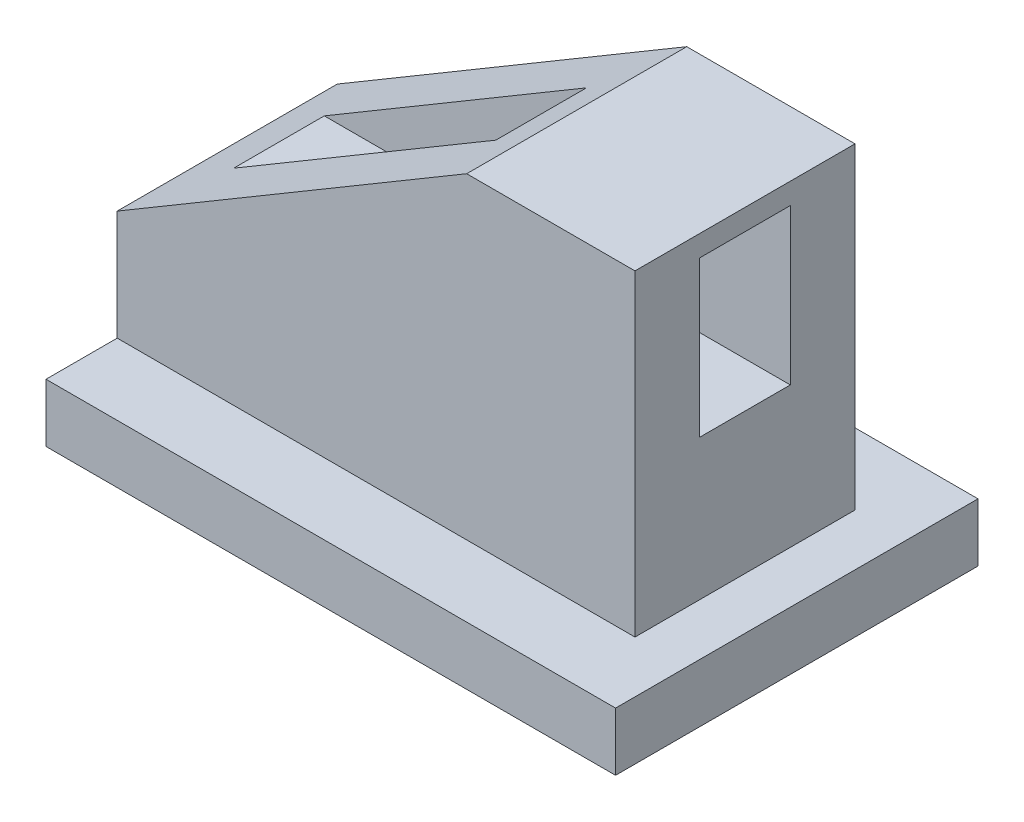
ISO-10303-21;
HEADER;
FILE_DESCRIPTION(('STEP AP214'),'2;1');
FILE_NAME('part.step','',(''),(''),'','','');
FILE_SCHEMA(('AUTOMOTIVE_DESIGN { 1 0 10303 214 1 1 1 1 }'));
ENDSEC;
DATA;
#1=APPLICATION_CONTEXT('core data for automotive mechanical design processes');
#2=APPLICATION_PROTOCOL_DEFINITION('international standard','automotive_design',2000,#1);
#3=PRODUCT_CONTEXT('',#1,'mechanical');
#4=PRODUCT('Part','Part','',(#3));
#5=PRODUCT_RELATED_PRODUCT_CATEGORY('part','',(#4));
#6=PRODUCT_DEFINITION_FORMATION('','',#4);
#7=PRODUCT_DEFINITION_CONTEXT('part definition',#1,'design');
#8=PRODUCT_DEFINITION('design','',#6,#7);
#9=PRODUCT_DEFINITION_SHAPE('','',#8);
#10=(LENGTH_UNIT() NAMED_UNIT(*) SI_UNIT(.MILLI.,.METRE.));
#11=(NAMED_UNIT(*) PLANE_ANGLE_UNIT() SI_UNIT($,.RADIAN.));
#12=(NAMED_UNIT(*) SI_UNIT($,.STERADIAN.) SOLID_ANGLE_UNIT());
#13=UNCERTAINTY_MEASURE_WITH_UNIT(LENGTH_MEASURE(1.E-05),#10,'distance_accuracy_value','');
#14=(GEOMETRIC_REPRESENTATION_CONTEXT(3) GLOBAL_UNCERTAINTY_ASSIGNED_CONTEXT((#13)) GLOBAL_UNIT_ASSIGNED_CONTEXT((#10,
#11,#12)) REPRESENTATION_CONTEXT('',''));
#15=CARTESIAN_POINT('',(0.,0.,0.));
#16=DIRECTION('',(0.,0.,1.));
#17=DIRECTION('',(1.,0.,0.));
#18=AXIS2_PLACEMENT_3D('',#15,#16,#17);
#19=CARTESIAN_POINT('',(0.,9.,0.));
#20=DIRECTION('',(0.,-1.,0.));
#21=DIRECTION('',(0.,0.,-1.));
#22=AXIS2_PLACEMENT_3D('',#19,#20,#21);
#23=PLANE('',#22);
#24=DIRECTION('',(1.,0.,0.));
#25=VECTOR('',#24,1.);
#26=CARTESIAN_POINT('',(-44.,9.,17.));
#27=LINE('',#26,#25);
#28=CARTESIAN_POINT('',(-44.,9.,17.));
#29=VERTEX_POINT('',#28);
#30=CARTESIAN_POINT('',(36.,9.,17.));
#31=VERTEX_POINT('',#30);
#32=EDGE_CURVE('E182',#29,#31,#27,.T.);
#33=ORIENTED_EDGE('',*,*,#32,.F.);
#34=DIRECTION('',(0.,0.,1.));
#35=VECTOR('',#34,1.);
#36=CARTESIAN_POINT('',(-44.,9.,28.));
#37=LINE('',#36,#35);
#38=CARTESIAN_POINT('',(-44.,9.,28.));
#39=VERTEX_POINT('',#38);
#40=EDGE_CURVE('E207',#29,#39,#37,.T.);
#41=ORIENTED_EDGE('',*,*,#40,.T.);
#42=DIRECTION('',(1.,0.,0.));
#43=VECTOR('',#42,1.);
#44=CARTESIAN_POINT('',(-44.,9.,28.));
#45=LINE('',#44,#43);
#46=CARTESIAN_POINT('',(44.,9.,28.));
#47=VERTEX_POINT('',#46);
#48=EDGE_CURVE('E211',#39,#47,#45,.T.);
#49=ORIENTED_EDGE('',*,*,#48,.T.);
#50=DIRECTION('',(0.,0.,-1.));
#51=VECTOR('',#50,1.);
#52=CARTESIAN_POINT('',(44.,9.,28.));
#53=LINE('',#52,#51);
#54=CARTESIAN_POINT('',(44.,9.,-28.));
#55=VERTEX_POINT('',#54);
#56=EDGE_CURVE('E201',#47,#55,#53,.T.);
#57=ORIENTED_EDGE('',*,*,#56,.T.);
#58=DIRECTION('',(-1.,0.,0.));
#59=VECTOR('',#58,1.);
#60=CARTESIAN_POINT('',(-44.,9.,-28.));
#61=LINE('',#60,#59);
#62=CARTESIAN_POINT('',(-44.,9.,-28.));
#63=VERTEX_POINT('',#62);
#64=EDGE_CURVE('E204',#55,#63,#61,.T.);
#65=ORIENTED_EDGE('',*,*,#64,.T.);
#66=CARTESIAN_POINT('',(-44.,9.,-17.));
#67=VERTEX_POINT('',#66);
#68=EDGE_CURVE('E208',#63,#67,#37,.T.);
#69=ORIENTED_EDGE('',*,*,#68,.T.);
#70=DIRECTION('',(1.,0.,0.));
#71=VECTOR('',#70,1.);
#72=CARTESIAN_POINT('',(-44.,9.,-17.));
#73=LINE('',#72,#71);
#74=CARTESIAN_POINT('',(36.,9.,-17.));
#75=VERTEX_POINT('',#74);
#76=EDGE_CURVE('E167',#67,#75,#73,.T.);
#77=ORIENTED_EDGE('',*,*,#76,.T.);
#78=DIRECTION('',(0.,0.,1.));
#79=VECTOR('',#78,1.);
#80=CARTESIAN_POINT('',(36.,9.,-17.));
#81=LINE('',#80,#79);
#82=EDGE_CURVE('E180',#75,#31,#81,.T.);
#83=ORIENTED_EDGE('',*,*,#82,.T.);
#84=EDGE_LOOP('',(#33,#41,#49,#57,#65,#69,#77,#83));
#85=FACE_BOUND('',#84,.T.);
#86=ADVANCED_FACE('F33',(#85),#23,.F.);
#87=CARTESIAN_POINT('',(44.,9.,28.));
#88=DIRECTION('',(-1.,0.,0.));
#89=DIRECTION('',(0.,0.,1.));
#90=AXIS2_PLACEMENT_3D('',#87,#88,#89);
#91=PLANE('',#90);
#92=DIRECTION('',(0.,0.,-1.));
#93=VECTOR('',#92,1.);
#94=CARTESIAN_POINT('',(44.,0.,28.));
#95=LINE('',#94,#93);
#96=CARTESIAN_POINT('',(44.,0.,28.));
#97=VERTEX_POINT('',#96);
#98=CARTESIAN_POINT('',(44.,0.,-28.));
#99=VERTEX_POINT('',#98);
#100=EDGE_CURVE('E194',#97,#99,#95,.T.);
#101=ORIENTED_EDGE('',*,*,#100,.T.);
#102=DIRECTION('',(0.,-1.,0.));
#103=VECTOR('',#102,1.);
#104=CARTESIAN_POINT('',(44.,9.,-28.));
#105=LINE('',#104,#103);
#106=EDGE_CURVE('E11',#55,#99,#105,.T.);
#107=ORIENTED_EDGE('',*,*,#106,.F.);
#108=ORIENTED_EDGE('',*,*,#56,.F.);
#109=DIRECTION('',(0.,-1.,0.));
#110=VECTOR('',#109,1.);
#111=CARTESIAN_POINT('',(44.,9.,28.));
#112=LINE('',#111,#110);
#113=EDGE_CURVE('E213',#47,#97,#112,.T.);
#114=ORIENTED_EDGE('',*,*,#113,.T.);
#115=EDGE_LOOP('',(#101,#107,#108,#114));
#116=FACE_BOUND('',#115,.T.);
#117=ADVANCED_FACE('F35',(#116),#91,.F.);
#118=CARTESIAN_POINT('',(-44.,9.,-28.));
#119=DIRECTION('',(0.,0.,1.));
#120=DIRECTION('',(1.,0.,0.));
#121=AXIS2_PLACEMENT_3D('',#118,#119,#120);
#122=PLANE('',#121);
#123=DIRECTION('',(-1.,0.,0.));
#124=VECTOR('',#123,1.);
#125=CARTESIAN_POINT('',(-44.,0.,-28.));
#126=LINE('',#125,#124);
#127=CARTESIAN_POINT('',(-44.,0.,-28.));
#128=VERTEX_POINT('',#127);
#129=EDGE_CURVE('E216',#99,#128,#126,.T.);
#130=ORIENTED_EDGE('',*,*,#129,.T.);
#131=DIRECTION('',(0.,-1.,0.));
#132=VECTOR('',#131,1.);
#133=CARTESIAN_POINT('',(-44.,9.,-28.));
#134=LINE('',#133,#132);
#135=EDGE_CURVE('E41',#63,#128,#134,.T.);
#136=ORIENTED_EDGE('',*,*,#135,.F.);
#137=ORIENTED_EDGE('',*,*,#64,.F.);
#138=ORIENTED_EDGE('',*,*,#106,.T.);
#139=EDGE_LOOP('',(#130,#136,#137,#138));
#140=FACE_BOUND('',#139,.T.);
#141=ADVANCED_FACE('F277',(#140),#122,.F.);
#142=CARTESIAN_POINT('',(-44.,9.,28.));
#143=DIRECTION('',(1.,0.,0.));
#144=DIRECTION('',(0.,0.,-1.));
#145=AXIS2_PLACEMENT_3D('',#142,#143,#144);
#146=PLANE('',#145);
#147=DIRECTION('',(0.,0.,1.));
#148=VECTOR('',#147,1.);
#149=CARTESIAN_POINT('',(-44.,0.,28.));
#150=LINE('',#149,#148);
#151=CARTESIAN_POINT('',(-44.,0.,28.));
#152=VERTEX_POINT('',#151);
#153=EDGE_CURVE('E218',#128,#152,#150,.T.);
#154=ORIENTED_EDGE('',*,*,#153,.T.);
#155=DIRECTION('',(0.,-1.,0.));
#156=VECTOR('',#155,1.);
#157=CARTESIAN_POINT('',(-44.,9.,28.));
#158=LINE('',#157,#156);
#159=EDGE_CURVE('E223',#39,#152,#158,.T.);
#160=ORIENTED_EDGE('',*,*,#159,.F.);
#161=ORIENTED_EDGE('',*,*,#40,.F.);
#162=DIRECTION('',(0.,-1.,0.));
#163=VECTOR('',#162,1.);
#164=CARTESIAN_POINT('',(-44.,26.,17.));
#165=LINE('',#164,#163);
#166=CARTESIAN_POINT('',(-44.,26.,17.));
#167=VERTEX_POINT('',#166);
#168=EDGE_CURVE('E163',#167,#29,#165,.T.);
#169=ORIENTED_EDGE('',*,*,#168,.F.);
#170=DIRECTION('',(0.,0.,1.));
#171=VECTOR('',#170,1.);
#172=CARTESIAN_POINT('',(-44.,26.,-17.));
#173=LINE('',#172,#171);
#174=CARTESIAN_POINT('',(-44.,26.,-17.));
#175=VERTEX_POINT('',#174);
#176=EDGE_CURVE('E192',#175,#167,#173,.T.);
#177=ORIENTED_EDGE('',*,*,#176,.F.);
#178=DIRECTION('',(0.,-1.,0.));
#179=VECTOR('',#178,1.);
#180=CARTESIAN_POINT('',(-44.,26.,-17.));
#181=LINE('',#180,#179);
#182=EDGE_CURVE('E164',#175,#67,#181,.T.);
#183=ORIENTED_EDGE('',*,*,#182,.T.);
#184=ORIENTED_EDGE('',*,*,#68,.F.);
#185=ORIENTED_EDGE('',*,*,#135,.T.);
#186=EDGE_LOOP('',(#154,#160,#161,#169,#177,#183,#184,#185));
#187=FACE_BOUND('',#186,.T.);
#188=ADVANCED_FACE('F230',(#187),#146,.F.);
#189=CARTESIAN_POINT('',(-44.,9.,28.));
#190=DIRECTION('',(0.,0.,-1.));
#191=DIRECTION('',(-1.,0.,0.));
#192=AXIS2_PLACEMENT_3D('',#189,#190,#191);
#193=PLANE('',#192);
#194=DIRECTION('',(1.,0.,0.));
#195=VECTOR('',#194,1.);
#196=CARTESIAN_POINT('',(-44.,0.,28.));
#197=LINE('',#196,#195);
#198=EDGE_CURVE('E205',#152,#97,#197,.T.);
#199=ORIENTED_EDGE('',*,*,#198,.T.);
#200=ORIENTED_EDGE('',*,*,#113,.F.);
#201=ORIENTED_EDGE('',*,*,#48,.F.);
#202=ORIENTED_EDGE('',*,*,#159,.T.);
#203=EDGE_LOOP('',(#199,#200,#201,#202));
#204=FACE_BOUND('',#203,.T.);
#205=ADVANCED_FACE('F239',(#204),#193,.F.);
#206=CARTESIAN_POINT('',(0.,0.,0.));
#207=DIRECTION('',(0.,-1.,0.));
#208=DIRECTION('',(0.,0.,-1.));
#209=AXIS2_PLACEMENT_3D('',#206,#207,#208);
#210=PLANE('',#209);
#211=ORIENTED_EDGE('',*,*,#100,.F.);
#212=ORIENTED_EDGE('',*,*,#198,.F.);
#213=ORIENTED_EDGE('',*,*,#153,.F.);
#214=ORIENTED_EDGE('',*,*,#129,.F.);
#215=EDGE_LOOP('',(#211,#212,#213,#214));
#216=FACE_BOUND('',#215,.T.);
#217=ADVANCED_FACE('F236',(#216),#210,.T.);
#218=CARTESIAN_POINT('',(9.99999999999999,58.,-17.));
#219=DIRECTION('',(-0.509802390301733,0.860291533634174,0.));
#220=DIRECTION('',(-0.860291533634174,-0.509802390301733,0.));
#221=AXIS2_PLACEMENT_3D('',#218,#219,#220);
#222=PLANE('',#221);
#223=DIRECTION('',(-0.860291533634174,-0.509802390301733,0.));
#224=VECTOR('',#223,1.);
#225=CARTESIAN_POINT('',(9.99999999999999,58.,-7.));
#226=LINE('',#225,#224);
#227=CARTESIAN_POINT('',(4.49874999999998,54.74,-7.));
#228=VERTEX_POINT('',#227);
#229=CARTESIAN_POINT('',(-36.00125,30.74,-7.));
#230=VERTEX_POINT('',#229);
#231=EDGE_CURVE('E161',#228,#230,#226,.T.);
#232=ORIENTED_EDGE('',*,*,#231,.F.);
#233=DIRECTION('',(0.,0.,-1.));
#234=VECTOR('',#233,1.);
#235=CARTESIAN_POINT('',(4.49874999999997,54.74,-17.));
#236=LINE('',#235,#234);
#237=CARTESIAN_POINT('',(4.49874999999997,54.74,7.));
#238=VERTEX_POINT('',#237);
#239=EDGE_CURVE('E154',#238,#228,#236,.T.);
#240=ORIENTED_EDGE('',*,*,#239,.F.);
#241=DIRECTION('',(0.860291533634174,0.509802390301733,0.));
#242=VECTOR('',#241,1.);
#243=CARTESIAN_POINT('',(9.99999999999999,58.,7.));
#244=LINE('',#243,#242);
#245=CARTESIAN_POINT('',(-36.0012500000001,30.74,7.));
#246=VERTEX_POINT('',#245);
#247=EDGE_CURVE('E134',#246,#238,#244,.T.);
#248=ORIENTED_EDGE('',*,*,#247,.F.);
#249=DIRECTION('',(0.,0.,1.));
#250=VECTOR('',#249,1.);
#251=CARTESIAN_POINT('',(-36.00125,30.74,-17.));
#252=LINE('',#251,#250);
#253=EDGE_CURVE('E159',#230,#246,#252,.T.);
#254=ORIENTED_EDGE('',*,*,#253,.F.);
#255=EDGE_LOOP('',(#232,#240,#248,#254));
#256=FACE_BOUND('',#255,.T.);
#257=DIRECTION('',(-0.860291533634174,-0.509802390301733,0.));
#258=VECTOR('',#257,1.);
#259=CARTESIAN_POINT('',(9.99999999999999,58.,17.));
#260=LINE('',#259,#258);
#261=CARTESIAN_POINT('',(9.99999999999999,58.,17.));
#262=VERTEX_POINT('',#261);
#263=EDGE_CURVE('E168',#262,#167,#260,.T.);
#264=ORIENTED_EDGE('',*,*,#263,.F.);
#265=DIRECTION('',(0.,0.,1.));
#266=VECTOR('',#265,1.);
#267=CARTESIAN_POINT('',(9.99999999999999,58.,-17.));
#268=LINE('',#267,#266);
#269=CARTESIAN_POINT('',(9.99999999999999,58.,-17.));
#270=VERTEX_POINT('',#269);
#271=EDGE_CURVE('E195',#270,#262,#268,.T.);
#272=ORIENTED_EDGE('',*,*,#271,.F.);
#273=DIRECTION('',(-0.860291533634174,-0.509802390301733,0.));
#274=VECTOR('',#273,1.);
#275=CARTESIAN_POINT('',(9.99999999999999,58.,-17.));
#276=LINE('',#275,#274);
#277=EDGE_CURVE('E177',#270,#175,#276,.T.);
#278=ORIENTED_EDGE('',*,*,#277,.T.);
#279=ORIENTED_EDGE('',*,*,#176,.T.);
#280=EDGE_LOOP('',(#264,#272,#278,#279));
#281=FACE_BOUND('',#280,.T.);
#282=ADVANCED_FACE('F254',(#256,#281),#222,.T.);
#283=CARTESIAN_POINT('',(36.,58.,-17.));
#284=DIRECTION('',(0.,1.,0.));
#285=DIRECTION('',(-1.,0.,0.));
#286=AXIS2_PLACEMENT_3D('',#283,#284,#285);
#287=PLANE('',#286);
#288=DIRECTION('',(-1.,0.,0.));
#289=VECTOR('',#288,1.);
#290=CARTESIAN_POINT('',(36.,58.,17.));
#291=LINE('',#290,#289);
#292=CARTESIAN_POINT('',(36.,58.,17.));
#293=VERTEX_POINT('',#292);
#294=EDGE_CURVE('E187',#293,#262,#291,.T.);
#295=ORIENTED_EDGE('',*,*,#294,.F.);
#296=DIRECTION('',(0.,0.,1.));
#297=VECTOR('',#296,1.);
#298=CARTESIAN_POINT('',(36.,58.,-17.));
#299=LINE('',#298,#297);
#300=CARTESIAN_POINT('',(36.,58.,-17.));
#301=VERTEX_POINT('',#300);
#302=EDGE_CURVE('E197',#301,#293,#299,.T.);
#303=ORIENTED_EDGE('',*,*,#302,.F.);
#304=DIRECTION('',(-1.,0.,0.));
#305=VECTOR('',#304,1.);
#306=CARTESIAN_POINT('',(36.,58.,-17.));
#307=LINE('',#306,#305);
#308=EDGE_CURVE('E174',#301,#270,#307,.T.);
#309=ORIENTED_EDGE('',*,*,#308,.T.);
#310=ORIENTED_EDGE('',*,*,#271,.T.);
#311=EDGE_LOOP('',(#295,#303,#309,#310));
#312=FACE_BOUND('',#311,.T.);
#313=ADVANCED_FACE('F262',(#312),#287,.T.);
#314=CARTESIAN_POINT('',(36.,9.,-17.));
#315=DIRECTION('',(1.,0.,0.));
#316=DIRECTION('',(0.,0.,-1.));
#317=AXIS2_PLACEMENT_3D('',#314,#315,#316);
#318=PLANE('',#317);
#319=DIRECTION('',(0.,1.,0.));
#320=VECTOR('',#319,1.);
#321=CARTESIAN_POINT('',(36.,30.74,-7.));
#322=LINE('',#321,#320);
#323=CARTESIAN_POINT('',(36.,30.74,-7.));
#324=VERTEX_POINT('',#323);
#325=CARTESIAN_POINT('',(36.,54.74,-7.));
#326=VERTEX_POINT('',#325);
#327=EDGE_CURVE('E56',#324,#326,#322,.T.);
#328=ORIENTED_EDGE('',*,*,#327,.F.);
#329=DIRECTION('',(0.,0.,-1.));
#330=VECTOR('',#329,1.);
#331=CARTESIAN_POINT('',(36.,30.74,7.));
#332=LINE('',#331,#330);
#333=CARTESIAN_POINT('',(36.,30.74,7.));
#334=VERTEX_POINT('',#333);
#335=EDGE_CURVE('E147',#334,#324,#332,.T.);
#336=ORIENTED_EDGE('',*,*,#335,.F.);
#337=DIRECTION('',(0.,-1.,0.));
#338=VECTOR('',#337,1.);
#339=CARTESIAN_POINT('',(36.,30.74,7.));
#340=LINE('',#339,#338);
#341=CARTESIAN_POINT('',(36.,54.74,7.));
#342=VERTEX_POINT('',#341);
#343=EDGE_CURVE('E131',#342,#334,#340,.T.);
#344=ORIENTED_EDGE('',*,*,#343,.F.);
#345=DIRECTION('',(0.,0.,1.));
#346=VECTOR('',#345,1.);
#347=CARTESIAN_POINT('',(36.,54.74,7.));
#348=LINE('',#347,#346);
#349=EDGE_CURVE('E140',#326,#342,#348,.T.);
#350=ORIENTED_EDGE('',*,*,#349,.F.);
#351=EDGE_LOOP('',(#328,#336,#344,#350));
#352=FACE_BOUND('',#351,.T.);
#353=DIRECTION('',(0.,1.,0.));
#354=VECTOR('',#353,1.);
#355=CARTESIAN_POINT('',(36.,9.,17.));
#356=LINE('',#355,#354);
#357=EDGE_CURVE('E184',#31,#293,#356,.T.);
#358=ORIENTED_EDGE('',*,*,#357,.F.);
#359=ORIENTED_EDGE('',*,*,#82,.F.);
#360=DIRECTION('',(0.,1.,0.));
#361=VECTOR('',#360,1.);
#362=CARTESIAN_POINT('',(36.,9.,-17.));
#363=LINE('',#362,#361);
#364=EDGE_CURVE('E171',#75,#301,#363,.T.);
#365=ORIENTED_EDGE('',*,*,#364,.T.);
#366=ORIENTED_EDGE('',*,*,#302,.T.);
#367=EDGE_LOOP('',(#358,#359,#365,#366));
#368=FACE_BOUND('',#367,.T.);
#369=ADVANCED_FACE('F144',(#352,#368),#318,.T.);
#370=CARTESIAN_POINT('',(0.,0.,-17.));
#371=DIRECTION('',(0.,0.,1.));
#372=DIRECTION('',(1.,0.,0.));
#373=AXIS2_PLACEMENT_3D('',#370,#371,#372);
#374=PLANE('',#373);
#375=ORIENTED_EDGE('',*,*,#182,.F.);
#376=ORIENTED_EDGE('',*,*,#277,.F.);
#377=ORIENTED_EDGE('',*,*,#308,.F.);
#378=ORIENTED_EDGE('',*,*,#364,.F.);
#379=ORIENTED_EDGE('',*,*,#76,.F.);
#380=EDGE_LOOP('',(#375,#376,#377,#378,#379));
#381=FACE_BOUND('',#380,.T.);
#382=ADVANCED_FACE('F258',(#381),#374,.F.);
#383=CARTESIAN_POINT('',(0.,0.,17.));
#384=DIRECTION('',(0.,0.,1.));
#385=DIRECTION('',(1.,0.,0.));
#386=AXIS2_PLACEMENT_3D('',#383,#384,#385);
#387=PLANE('',#386);
#388=ORIENTED_EDGE('',*,*,#168,.T.);
#389=ORIENTED_EDGE('',*,*,#32,.T.);
#390=ORIENTED_EDGE('',*,*,#357,.T.);
#391=ORIENTED_EDGE('',*,*,#294,.T.);
#392=ORIENTED_EDGE('',*,*,#263,.T.);
#393=EDGE_LOOP('',(#388,#389,#390,#391,#392));
#394=FACE_BOUND('',#393,.T.);
#395=ADVANCED_FACE('F251',(#394),#387,.T.);
#396=CARTESIAN_POINT('',(-44.,30.74,-7.));
#397=DIRECTION('',(0.,0.,-1.));
#398=DIRECTION('',(-1.,0.,0.));
#399=AXIS2_PLACEMENT_3D('',#396,#397,#398);
#400=PLANE('',#399);
#401=ORIENTED_EDGE('',*,*,#231,.T.);
#402=DIRECTION('',(1.,0.,0.));
#403=VECTOR('',#402,1.);
#404=CARTESIAN_POINT('',(-44.,30.74,-7.));
#405=LINE('',#404,#403);
#406=EDGE_CURVE('E152',#230,#324,#405,.T.);
#407=ORIENTED_EDGE('',*,*,#406,.T.);
#408=ORIENTED_EDGE('',*,*,#327,.T.);
#409=DIRECTION('',(1.,0.,0.));
#410=VECTOR('',#409,1.);
#411=CARTESIAN_POINT('',(-44.,54.74,-7.));
#412=LINE('',#411,#410);
#413=EDGE_CURVE('E137',#228,#326,#412,.T.);
#414=ORIENTED_EDGE('',*,*,#413,.F.);
#415=EDGE_LOOP('',(#401,#407,#408,#414));
#416=FACE_BOUND('',#415,.T.);
#417=ADVANCED_FACE('F324',(#416),#400,.F.);
#418=CARTESIAN_POINT('',(-44.,30.74,7.));
#419=DIRECTION('',(0.,-1.,0.));
#420=DIRECTION('',(0.,0.,-1.));
#421=AXIS2_PLACEMENT_3D('',#418,#419,#420);
#422=PLANE('',#421);
#423=ORIENTED_EDGE('',*,*,#253,.T.);
#424=DIRECTION('',(1.,0.,0.));
#425=VECTOR('',#424,1.);
#426=CARTESIAN_POINT('',(-44.,30.74,7.));
#427=LINE('',#426,#425);
#428=EDGE_CURVE('E136',#246,#334,#427,.T.);
#429=ORIENTED_EDGE('',*,*,#428,.T.);
#430=ORIENTED_EDGE('',*,*,#335,.T.);
#431=ORIENTED_EDGE('',*,*,#406,.F.);
#432=EDGE_LOOP('',(#423,#429,#430,#431));
#433=FACE_BOUND('',#432,.T.);
#434=ADVANCED_FACE('F329',(#433),#422,.F.);
#435=CARTESIAN_POINT('',(-44.,30.74,7.));
#436=DIRECTION('',(0.,0.,1.));
#437=DIRECTION('',(1.,0.,0.));
#438=AXIS2_PLACEMENT_3D('',#435,#436,#437);
#439=PLANE('',#438);
#440=ORIENTED_EDGE('',*,*,#247,.T.);
#441=DIRECTION('',(1.,0.,0.));
#442=VECTOR('',#441,1.);
#443=CARTESIAN_POINT('',(-44.,54.74,7.));
#444=LINE('',#443,#442);
#445=EDGE_CURVE('E48',#238,#342,#444,.T.);
#446=ORIENTED_EDGE('',*,*,#445,.T.);
#447=ORIENTED_EDGE('',*,*,#343,.T.);
#448=ORIENTED_EDGE('',*,*,#428,.F.);
#449=EDGE_LOOP('',(#440,#446,#447,#448));
#450=FACE_BOUND('',#449,.T.);
#451=ADVANCED_FACE('F128',(#450),#439,.F.);
#452=CARTESIAN_POINT('',(-44.,54.74,7.));
#453=DIRECTION('',(0.,1.,0.));
#454=DIRECTION('',(0.,0.,1.));
#455=AXIS2_PLACEMENT_3D('',#452,#453,#454);
#456=PLANE('',#455);
#457=ORIENTED_EDGE('',*,*,#239,.T.);
#458=ORIENTED_EDGE('',*,*,#413,.T.);
#459=ORIENTED_EDGE('',*,*,#349,.T.);
#460=ORIENTED_EDGE('',*,*,#445,.F.);
#461=EDGE_LOOP('',(#457,#458,#459,#460));
#462=FACE_BOUND('',#461,.T.);
#463=ADVANCED_FACE('F141',(#462),#456,.F.);
#464=CLOSED_SHELL('',(#86,#117,#141,#188,#205,#217,#282,#313,#369,#382,#395,#417,#434,#451,#463));
#465=MANIFOLD_SOLID_BREP('B2',#464);
#466=ADVANCED_BREP_SHAPE_REPRESENTATION('',(#18,#465),#14);
#467=SHAPE_DEFINITION_REPRESENTATION(#9,#466);
ENDSEC;
END-ISO-10303-21;
